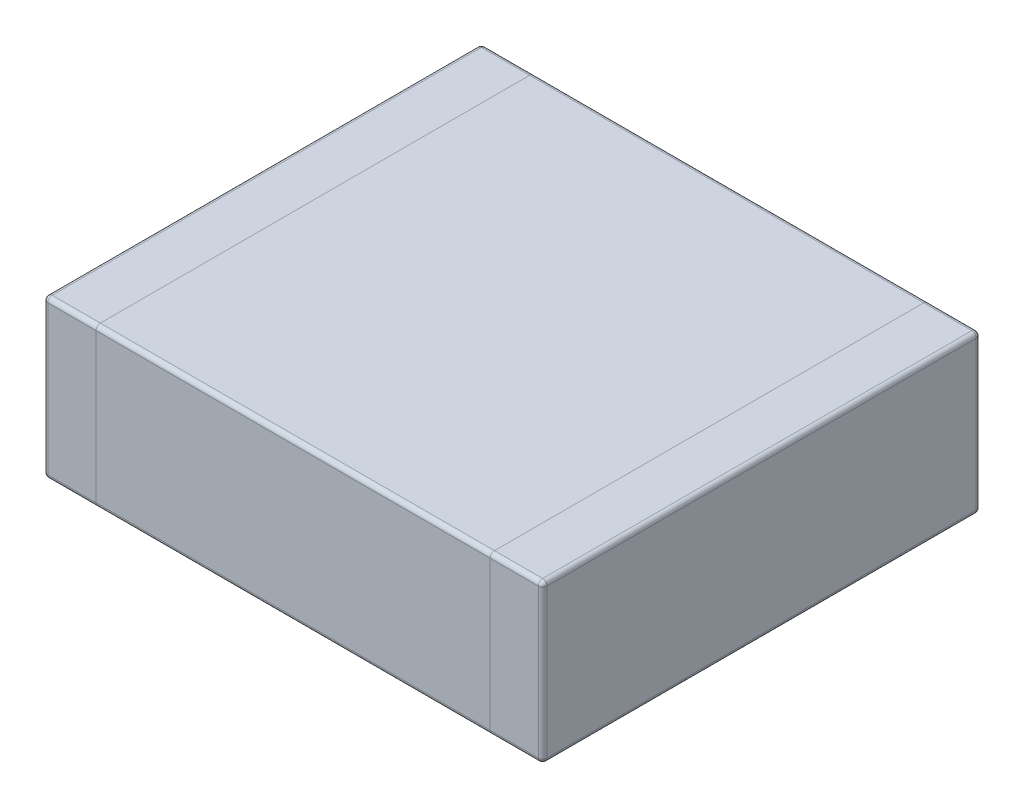
ISO-10303-21;
HEADER;
FILE_DESCRIPTION(('STEP AP214'),'2;1');
FILE_NAME('part.step','',(''),(''),'','','');
FILE_SCHEMA(('AUTOMOTIVE_DESIGN { 1 0 10303 214 1 1 1 1 }'));
ENDSEC;
DATA;
#1=APPLICATION_CONTEXT('core data for automotive mechanical design processes');
#2=APPLICATION_PROTOCOL_DEFINITION('international standard','automotive_design',2000,#1);
#3=PRODUCT_CONTEXT('',#1,'mechanical');
#4=PRODUCT('Part','Part','',(#3));
#5=PRODUCT_RELATED_PRODUCT_CATEGORY('part','',(#4));
#6=PRODUCT_DEFINITION_FORMATION('','',#4);
#7=PRODUCT_DEFINITION_CONTEXT('part definition',#1,'design');
#8=PRODUCT_DEFINITION('design','',#6,#7);
#9=PRODUCT_DEFINITION_SHAPE('','',#8);
#10=(LENGTH_UNIT() NAMED_UNIT(*) SI_UNIT(.MILLI.,.METRE.));
#11=(NAMED_UNIT(*) PLANE_ANGLE_UNIT() SI_UNIT($,.RADIAN.));
#12=(NAMED_UNIT(*) SI_UNIT($,.STERADIAN.) SOLID_ANGLE_UNIT());
#13=UNCERTAINTY_MEASURE_WITH_UNIT(LENGTH_MEASURE(1.E-05),#10,'distance_accuracy_value','');
#14=(GEOMETRIC_REPRESENTATION_CONTEXT(3) GLOBAL_UNCERTAINTY_ASSIGNED_CONTEXT((#13)) GLOBAL_UNIT_ASSIGNED_CONTEXT((#10,
#11,#12)) REPRESENTATION_CONTEXT('',''));
#15=CARTESIAN_POINT('',(0.,0.,0.));
#16=DIRECTION('',(0.,0.,1.));
#17=DIRECTION('',(1.,0.,0.));
#18=AXIS2_PLACEMENT_3D('',#15,#16,#17);
#19=CARTESIAN_POINT('',(2.85,1.8,-2.5));
#20=DIRECTION('',(0.,-1.,0.));
#21=DIRECTION('',(0.,0.,-1.));
#22=AXIS2_PLACEMENT_3D('',#19,#20,#21);
#23=PLANE('',#22);
#24=DIRECTION('',(0.,0.,1.));
#25=VECTOR('',#24,1.);
#26=CARTESIAN_POINT('',(-2.25,1.8,-2.5));
#27=LINE('',#26,#25);
#28=CARTESIAN_POINT('',(-2.25,1.8,-2.45));
#29=VERTEX_POINT('',#28);
#30=CARTESIAN_POINT('',(-2.25,1.8,2.45));
#31=VERTEX_POINT('',#30);
#32=EDGE_CURVE('E11',#29,#31,#27,.T.);
#33=ORIENTED_EDGE('',*,*,#32,.F.);
#34=DIRECTION('',(-1.,0.,0.));
#35=VECTOR('',#34,1.);
#36=CARTESIAN_POINT('',(2.85,1.8,-2.45));
#37=LINE('',#36,#35);
#38=CARTESIAN_POINT('',(-2.8,1.8,-2.45));
#39=VERTEX_POINT('',#38);
#40=EDGE_CURVE('E253',#29,#39,#37,.T.);
#41=ORIENTED_EDGE('',*,*,#40,.T.);
#42=DIRECTION('',(0.,0.,1.));
#43=VECTOR('',#42,1.);
#44=CARTESIAN_POINT('',(-2.8,1.8,-2.5));
#45=LINE('',#44,#43);
#46=CARTESIAN_POINT('',(-2.8,1.8,2.45));
#47=VERTEX_POINT('',#46);
#48=EDGE_CURVE('E256',#39,#47,#45,.T.);
#49=ORIENTED_EDGE('',*,*,#48,.T.);
#50=DIRECTION('',(1.,0.,0.));
#51=VECTOR('',#50,1.);
#52=CARTESIAN_POINT('',(2.85,1.8,2.45));
#53=LINE('',#52,#51);
#54=EDGE_CURVE('E260',#47,#31,#53,.T.);
#55=ORIENTED_EDGE('',*,*,#54,.T.);
#56=EDGE_LOOP('',(#33,#41,#49,#55));
#57=FACE_BOUND('',#56,.T.);
#58=ADVANCED_FACE('F37',(#57),#23,.F.);
#59=DIRECTION('',(0.,0.,-1.));
#60=VECTOR('',#59,1.);
#61=CARTESIAN_POINT('',(2.25,1.8,-2.5));
#62=LINE('',#61,#60);
#63=CARTESIAN_POINT('',(2.25,1.8,2.45));
#64=VERTEX_POINT('',#63);
#65=CARTESIAN_POINT('',(2.25,1.8,-2.45));
#66=VERTEX_POINT('',#65);
#67=EDGE_CURVE('E47',#64,#66,#62,.T.);
#68=ORIENTED_EDGE('',*,*,#67,.F.);
#69=CARTESIAN_POINT('',(2.8,1.8,2.45));
#70=VERTEX_POINT('',#69);
#71=EDGE_CURVE('E259',#64,#70,#53,.T.);
#72=ORIENTED_EDGE('',*,*,#71,.T.);
#73=DIRECTION('',(0.,0.,-1.));
#74=VECTOR('',#73,1.);
#75=CARTESIAN_POINT('',(2.8,1.8,-2.5));
#76=LINE('',#75,#74);
#77=CARTESIAN_POINT('',(2.8,1.8,-2.45));
#78=VERTEX_POINT('',#77);
#79=EDGE_CURVE('E250',#70,#78,#76,.T.);
#80=ORIENTED_EDGE('',*,*,#79,.T.);
#81=EDGE_CURVE('E254',#78,#66,#37,.T.);
#82=ORIENTED_EDGE('',*,*,#81,.T.);
#83=EDGE_LOOP('',(#68,#72,#80,#82));
#84=FACE_BOUND('',#83,.T.);
#85=ADVANCED_FACE('F526',(#84),#23,.F.);
#86=CARTESIAN_POINT('',(2.85,1.75,2.45));
#87=DIRECTION('',(1.,0.,0.));
#88=DIRECTION('',(0.,0.,-1.));
#89=AXIS2_PLACEMENT_3D('',#86,#87,#88);
#90=CYLINDRICAL_SURFACE('',#89,0.05);
#91=DIRECTION('',(1.,0.,0.));
#92=VECTOR('',#91,1.);
#93=CARTESIAN_POINT('',(-2.85,1.75,2.5));
#94=LINE('',#93,#92);
#95=CARTESIAN_POINT('',(-2.25,1.75,2.5));
#96=VERTEX_POINT('',#95);
#97=CARTESIAN_POINT('',(-2.8,1.75,2.5));
#98=VERTEX_POINT('',#97);
#99=EDGE_CURVE('E246',#96,#98,#94,.F.);
#100=ORIENTED_EDGE('',*,*,#99,.F.);
#101=CARTESIAN_POINT('',(-2.25,1.75,2.45));
#102=DIRECTION('',(1.,0.,0.));
#103=DIRECTION('',(0.,0.,-1.));
#104=AXIS2_PLACEMENT_3D('',#101,#102,#103);
#105=CIRCLE('',#104,0.05);
#106=EDGE_CURVE('E354',#96,#31,#105,.F.);
#107=ORIENTED_EDGE('',*,*,#106,.T.);
#108=ORIENTED_EDGE('',*,*,#54,.F.);
#109=CARTESIAN_POINT('',(-2.8,1.75,2.45));
#110=DIRECTION('',(-1.,0.,0.));
#111=DIRECTION('',(0.,-1.,0.));
#112=AXIS2_PLACEMENT_3D('',#109,#110,#111);
#113=CIRCLE('',#112,0.05);
#114=EDGE_CURVE('E330',#47,#98,#113,.F.);
#115=ORIENTED_EDGE('',*,*,#114,.T.);
#116=EDGE_LOOP('',(#100,#107,#108,#115));
#117=FACE_BOUND('',#116,.T.);
#118=ADVANCED_FACE('F483',(#117),#90,.T.);
#119=ORIENTED_EDGE('',*,*,#71,.F.);
#120=CARTESIAN_POINT('',(2.25,1.75,2.45));
#121=DIRECTION('',(-1.,0.,0.));
#122=DIRECTION('',(0.,0.,1.));
#123=AXIS2_PLACEMENT_3D('',#120,#121,#122);
#124=CIRCLE('',#123,0.05);
#125=CARTESIAN_POINT('',(2.25,1.75,2.5));
#126=VERTEX_POINT('',#125);
#127=EDGE_CURVE('E353',#64,#126,#124,.F.);
#128=ORIENTED_EDGE('',*,*,#127,.T.);
#129=CARTESIAN_POINT('',(2.8,1.75,2.5));
#130=VERTEX_POINT('',#129);
#131=EDGE_CURVE('E247',#130,#126,#94,.F.);
#132=ORIENTED_EDGE('',*,*,#131,.F.);
#133=CARTESIAN_POINT('',(2.8,1.75,2.45));
#134=DIRECTION('',(1.,0.,0.));
#135=DIRECTION('',(0.,0.,-1.));
#136=AXIS2_PLACEMENT_3D('',#133,#134,#135);
#137=CIRCLE('',#136,0.05);
#138=EDGE_CURVE('E315',#70,#130,#137,.T.);
#139=ORIENTED_EDGE('',*,*,#138,.F.);
#140=EDGE_LOOP('',(#119,#128,#132,#139));
#141=FACE_BOUND('',#140,.T.);
#142=ADVANCED_FACE('F457',(#141),#90,.T.);
#143=CARTESIAN_POINT('',(-2.85,1.8,2.5));
#144=DIRECTION('',(0.,0.,-1.));
#145=DIRECTION('',(-1.,0.,0.));
#146=AXIS2_PLACEMENT_3D('',#143,#144,#145);
#147=PLANE('',#146);
#148=DIRECTION('',(0.,-1.,0.));
#149=VECTOR('',#148,1.);
#150=CARTESIAN_POINT('',(-2.25,1.8,2.5));
#151=LINE('',#150,#149);
#152=CARTESIAN_POINT('',(-2.25,0.0499999999999999,2.5));
#153=VERTEX_POINT('',#152);
#154=EDGE_CURVE('E349',#96,#153,#151,.T.);
#155=ORIENTED_EDGE('',*,*,#154,.F.);
#156=ORIENTED_EDGE('',*,*,#99,.T.);
#157=DIRECTION('',(0.,-1.,0.));
#158=VECTOR('',#157,1.);
#159=CARTESIAN_POINT('',(-2.8,1.8,2.5));
#160=LINE('',#159,#158);
#161=CARTESIAN_POINT('',(-2.8,0.0499999999999999,2.5));
#162=VERTEX_POINT('',#161);
#163=EDGE_CURVE('E243',#98,#162,#160,.T.);
#164=ORIENTED_EDGE('',*,*,#163,.T.);
#165=DIRECTION('',(1.,0.,0.));
#166=VECTOR('',#165,1.);
#167=CARTESIAN_POINT('',(2.85,0.0499999999999999,2.5));
#168=LINE('',#167,#166);
#169=EDGE_CURVE('E237',#162,#153,#168,.T.);
#170=ORIENTED_EDGE('',*,*,#169,.T.);
#171=EDGE_LOOP('',(#155,#156,#164,#170));
#172=FACE_BOUND('',#171,.T.);
#173=ADVANCED_FACE('F471',(#172),#147,.F.);
#174=DIRECTION('',(0.,1.,0.));
#175=VECTOR('',#174,1.);
#176=CARTESIAN_POINT('',(2.25,1.8,2.5));
#177=LINE('',#176,#175);
#178=CARTESIAN_POINT('',(2.25,0.0499999999999999,2.5));
#179=VERTEX_POINT('',#178);
#180=EDGE_CURVE('E345',#179,#126,#177,.T.);
#181=ORIENTED_EDGE('',*,*,#180,.F.);
#182=CARTESIAN_POINT('',(2.8,0.0499999999999999,2.5));
#183=VERTEX_POINT('',#182);
#184=EDGE_CURVE('E236',#179,#183,#168,.T.);
#185=ORIENTED_EDGE('',*,*,#184,.T.);
#186=DIRECTION('',(0.,-1.,0.));
#187=VECTOR('',#186,1.);
#188=CARTESIAN_POINT('',(2.8,1.8,2.5));
#189=LINE('',#188,#187);
#190=EDGE_CURVE('E240',#183,#130,#189,.F.);
#191=ORIENTED_EDGE('',*,*,#190,.T.);
#192=ORIENTED_EDGE('',*,*,#131,.T.);
#193=EDGE_LOOP('',(#181,#185,#191,#192));
#194=FACE_BOUND('',#193,.T.);
#195=ADVANCED_FACE('F453',(#194),#147,.F.);
#196=CARTESIAN_POINT('',(-2.85,0.0499999999999999,2.45));
#197=DIRECTION('',(-1.,0.,0.));
#198=DIRECTION('',(0.,0.,1.));
#199=AXIS2_PLACEMENT_3D('',#196,#197,#198);
#200=CYLINDRICAL_SURFACE('',#199,0.05);
#201=DIRECTION('',(1.,0.,0.));
#202=VECTOR('',#201,1.);
#203=CARTESIAN_POINT('',(-2.85,0.,2.45));
#204=LINE('',#203,#202);
#205=CARTESIAN_POINT('',(-2.25,0.,2.45));
#206=VERTEX_POINT('',#205);
#207=CARTESIAN_POINT('',(-2.8,0.,2.45));
#208=VERTEX_POINT('',#207);
#209=EDGE_CURVE('E266',#206,#208,#204,.F.);
#210=ORIENTED_EDGE('',*,*,#209,.F.);
#211=CARTESIAN_POINT('',(-2.25,0.0499999999999999,2.45));
#212=DIRECTION('',(1.,0.,0.));
#213=DIRECTION('',(0.,0.,-1.));
#214=AXIS2_PLACEMENT_3D('',#211,#212,#213);
#215=CIRCLE('',#214,0.05);
#216=EDGE_CURVE('E350',#206,#153,#215,.F.);
#217=ORIENTED_EDGE('',*,*,#216,.T.);
#218=ORIENTED_EDGE('',*,*,#169,.F.);
#219=CARTESIAN_POINT('',(-2.8,0.05,2.45));
#220=DIRECTION('',(-1.,0.,0.));
#221=DIRECTION('',(0.,0.,1.));
#222=AXIS2_PLACEMENT_3D('',#219,#220,#221);
#223=CIRCLE('',#222,0.05);
#224=EDGE_CURVE('E321',#162,#208,#223,.F.);
#225=ORIENTED_EDGE('',*,*,#224,.T.);
#226=EDGE_LOOP('',(#210,#217,#218,#225));
#227=FACE_BOUND('',#226,.T.);
#228=ADVANCED_FACE('F509',(#227),#200,.T.);
#229=ORIENTED_EDGE('',*,*,#184,.F.);
#230=CARTESIAN_POINT('',(2.25,0.0499999999999999,2.45));
#231=DIRECTION('',(-1.,0.,0.));
#232=DIRECTION('',(0.,0.,1.));
#233=AXIS2_PLACEMENT_3D('',#230,#231,#232);
#234=CIRCLE('',#233,0.05);
#235=CARTESIAN_POINT('',(2.25,0.,2.45));
#236=VERTEX_POINT('',#235);
#237=EDGE_CURVE('E365',#179,#236,#234,.F.);
#238=ORIENTED_EDGE('',*,*,#237,.T.);
#239=CARTESIAN_POINT('',(2.8,0.,2.45));
#240=VERTEX_POINT('',#239);
#241=EDGE_CURVE('E267',#240,#236,#204,.F.);
#242=ORIENTED_EDGE('',*,*,#241,.F.);
#243=CARTESIAN_POINT('',(2.8,0.0499999999999999,2.45));
#244=DIRECTION('',(1.,0.,0.));
#245=DIRECTION('',(0.,0.,-1.));
#246=AXIS2_PLACEMENT_3D('',#243,#244,#245);
#247=CIRCLE('',#246,0.05);
#248=EDGE_CURVE('E301',#183,#240,#247,.T.);
#249=ORIENTED_EDGE('',*,*,#248,.F.);
#250=EDGE_LOOP('',(#229,#238,#242,#249));
#251=FACE_BOUND('',#250,.T.);
#252=ADVANCED_FACE('F443',(#251),#200,.T.);
#253=CARTESIAN_POINT('',(2.85,0.,-2.5));
#254=DIRECTION('',(0.,-1.,0.));
#255=DIRECTION('',(0.,0.,-1.));
#256=AXIS2_PLACEMENT_3D('',#253,#254,#255);
#257=PLANE('',#256);
#258=DIRECTION('',(-1.,0.,0.));
#259=VECTOR('',#258,1.);
#260=CARTESIAN_POINT('',(2.85,0.,-2.45));
#261=LINE('',#260,#259);
#262=CARTESIAN_POINT('',(-2.8,0.,-2.45));
#263=VERTEX_POINT('',#262);
#264=CARTESIAN_POINT('',(-2.25,0.,-2.45));
#265=VERTEX_POINT('',#264);
#266=EDGE_CURVE('E274',#263,#265,#261,.F.);
#267=ORIENTED_EDGE('',*,*,#266,.T.);
#268=DIRECTION('',(0.,0.,1.));
#269=VECTOR('',#268,1.);
#270=CARTESIAN_POINT('',(-2.25,0.,-2.5));
#271=LINE('',#270,#269);
#272=EDGE_CURVE('E366',#265,#206,#271,.T.);
#273=ORIENTED_EDGE('',*,*,#272,.T.);
#274=ORIENTED_EDGE('',*,*,#209,.T.);
#275=DIRECTION('',(0.,0.,1.));
#276=VECTOR('',#275,1.);
#277=CARTESIAN_POINT('',(-2.8,0.,-2.5));
#278=LINE('',#277,#276);
#279=EDGE_CURVE('E270',#208,#263,#278,.F.);
#280=ORIENTED_EDGE('',*,*,#279,.T.);
#281=EDGE_LOOP('',(#267,#273,#274,#280));
#282=FACE_BOUND('',#281,.T.);
#283=ADVANCED_FACE('F512',(#282),#257,.T.);
#284=ORIENTED_EDGE('',*,*,#241,.T.);
#285=DIRECTION('',(0.,0.,-1.));
#286=VECTOR('',#285,1.);
#287=CARTESIAN_POINT('',(2.25,0.,-2.5));
#288=LINE('',#287,#286);
#289=CARTESIAN_POINT('',(2.25,0.,-2.45));
#290=VERTEX_POINT('',#289);
#291=EDGE_CURVE('E360',#236,#290,#288,.T.);
#292=ORIENTED_EDGE('',*,*,#291,.T.);
#293=CARTESIAN_POINT('',(2.8,0.,-2.45));
#294=VERTEX_POINT('',#293);
#295=EDGE_CURVE('E273',#290,#294,#261,.F.);
#296=ORIENTED_EDGE('',*,*,#295,.T.);
#297=DIRECTION('',(0.,0.,-1.));
#298=VECTOR('',#297,1.);
#299=CARTESIAN_POINT('',(2.8,0.,2.5));
#300=LINE('',#299,#298);
#301=EDGE_CURVE('E263',#294,#240,#300,.F.);
#302=ORIENTED_EDGE('',*,*,#301,.T.);
#303=EDGE_LOOP('',(#284,#292,#296,#302));
#304=FACE_BOUND('',#303,.T.);
#305=ADVANCED_FACE('F387',(#304),#257,.T.);
#306=CARTESIAN_POINT('',(2.85,1.75,-2.45));
#307=DIRECTION('',(-1.,0.,0.));
#308=DIRECTION('',(0.,0.,1.));
#309=AXIS2_PLACEMENT_3D('',#306,#307,#308);
#310=CYLINDRICAL_SURFACE('',#309,0.05);
#311=ORIENTED_EDGE('',*,*,#40,.F.);
#312=CARTESIAN_POINT('',(-2.25,1.75,-2.45));
#313=DIRECTION('',(1.,0.,0.));
#314=DIRECTION('',(0.,0.,-1.));
#315=AXIS2_PLACEMENT_3D('',#312,#313,#314);
#316=CIRCLE('',#315,0.05);
#317=CARTESIAN_POINT('',(-2.25,1.75,-2.5));
#318=VERTEX_POINT('',#317);
#319=EDGE_CURVE('E357',#29,#318,#316,.F.);
#320=ORIENTED_EDGE('',*,*,#319,.T.);
#321=DIRECTION('',(-1.,0.,0.));
#322=VECTOR('',#321,1.);
#323=CARTESIAN_POINT('',(-2.85,1.75,-2.5));
#324=LINE('',#323,#322);
#325=CARTESIAN_POINT('',(-2.8,1.75,-2.5));
#326=VERTEX_POINT('',#325);
#327=EDGE_CURVE('E216',#326,#318,#324,.F.);
#328=ORIENTED_EDGE('',*,*,#327,.F.);
#329=CARTESIAN_POINT('',(-2.8,1.75,-2.45));
#330=DIRECTION('',(-1.,0.,0.));
#331=DIRECTION('',(0.,0.,1.));
#332=AXIS2_PLACEMENT_3D('',#329,#330,#331);
#333=CIRCLE('',#332,0.05);
#334=EDGE_CURVE('E292',#326,#39,#333,.F.);
#335=ORIENTED_EDGE('',*,*,#334,.T.);
#336=EDGE_LOOP('',(#311,#320,#328,#335));
#337=FACE_BOUND('',#336,.T.);
#338=ADVANCED_FACE('F519',(#337),#310,.T.);
#339=CARTESIAN_POINT('',(2.25,1.75,-2.5));
#340=VERTEX_POINT('',#339);
#341=CARTESIAN_POINT('',(2.8,1.75,-2.5));
#342=VERTEX_POINT('',#341);
#343=EDGE_CURVE('E211',#340,#342,#324,.F.);
#344=ORIENTED_EDGE('',*,*,#343,.F.);
#345=CARTESIAN_POINT('',(2.25,1.75,-2.45));
#346=DIRECTION('',(-1.,0.,0.));
#347=DIRECTION('',(0.,0.,1.));
#348=AXIS2_PLACEMENT_3D('',#345,#346,#347);
#349=CIRCLE('',#348,0.05);
#350=EDGE_CURVE('E361',#340,#66,#349,.F.);
#351=ORIENTED_EDGE('',*,*,#350,.T.);
#352=ORIENTED_EDGE('',*,*,#81,.F.);
#353=CARTESIAN_POINT('',(2.8,1.75,-2.45));
#354=DIRECTION('',(1.,0.,0.));
#355=DIRECTION('',(0.,1.,0.));
#356=AXIS2_PLACEMENT_3D('',#353,#354,#355);
#357=CIRCLE('',#356,0.05);
#358=EDGE_CURVE('E196',#342,#78,#357,.T.);
#359=ORIENTED_EDGE('',*,*,#358,.F.);
#360=EDGE_LOOP('',(#344,#351,#352,#359));
#361=FACE_BOUND('',#360,.T.);
#362=ADVANCED_FACE('F422',(#361),#310,.T.);
#363=CARTESIAN_POINT('',(-2.85,0.0499999999999999,-2.45));
#364=DIRECTION('',(1.,0.,0.));
#365=DIRECTION('',(0.,0.,-1.));
#366=AXIS2_PLACEMENT_3D('',#363,#364,#365);
#367=CYLINDRICAL_SURFACE('',#366,0.05);
#368=DIRECTION('',(-1.,0.,0.));
#369=VECTOR('',#368,1.);
#370=CARTESIAN_POINT('',(-2.85,0.0499999999999999,-2.5));
#371=LINE('',#370,#369);
#372=CARTESIAN_POINT('',(-2.25,0.0499999999999999,-2.5));
#373=VERTEX_POINT('',#372);
#374=CARTESIAN_POINT('',(-2.8,0.0499999999999999,-2.5));
#375=VERTEX_POINT('',#374);
#376=EDGE_CURVE('E208',#373,#375,#371,.T.);
#377=ORIENTED_EDGE('',*,*,#376,.F.);
#378=CARTESIAN_POINT('',(-2.25,0.0499999999999999,-2.45));
#379=DIRECTION('',(1.,0.,0.));
#380=DIRECTION('',(0.,0.,-1.));
#381=AXIS2_PLACEMENT_3D('',#378,#379,#380);
#382=CIRCLE('',#381,0.05);
#383=EDGE_CURVE('E370',#373,#265,#382,.F.);
#384=ORIENTED_EDGE('',*,*,#383,.T.);
#385=ORIENTED_EDGE('',*,*,#266,.F.);
#386=CARTESIAN_POINT('',(-2.8,0.0499999999999999,-2.45));
#387=DIRECTION('',(-1.,0.,0.));
#388=DIRECTION('',(0.,0.,1.));
#389=AXIS2_PLACEMENT_3D('',#386,#387,#388);
#390=CIRCLE('',#389,0.05);
#391=EDGE_CURVE('E289',#263,#375,#390,.F.);
#392=ORIENTED_EDGE('',*,*,#391,.T.);
#393=EDGE_LOOP('',(#377,#384,#385,#392));
#394=FACE_BOUND('',#393,.T.);
#395=ADVANCED_FACE('F405',(#394),#367,.T.);
#396=ORIENTED_EDGE('',*,*,#295,.F.);
#397=CARTESIAN_POINT('',(2.25,0.0499999999999999,-2.45));
#398=DIRECTION('',(-1.,0.,0.));
#399=DIRECTION('',(0.,0.,1.));
#400=AXIS2_PLACEMENT_3D('',#397,#398,#399);
#401=CIRCLE('',#400,0.05);
#402=CARTESIAN_POINT('',(2.25,0.0499999999999999,-2.5));
#403=VERTEX_POINT('',#402);
#404=EDGE_CURVE('E41',#290,#403,#401,.F.);
#405=ORIENTED_EDGE('',*,*,#404,.T.);
#406=CARTESIAN_POINT('',(2.8,0.0499999999999999,-2.5));
#407=VERTEX_POINT('',#406);
#408=EDGE_CURVE('E199',#407,#403,#371,.T.);
#409=ORIENTED_EDGE('',*,*,#408,.F.);
#410=CARTESIAN_POINT('',(2.8,0.05,-2.45));
#411=DIRECTION('',(1.,0.,0.));
#412=DIRECTION('',(0.,0.,-1.));
#413=AXIS2_PLACEMENT_3D('',#410,#411,#412);
#414=CIRCLE('',#413,0.05);
#415=EDGE_CURVE('E188',#294,#407,#414,.T.);
#416=ORIENTED_EDGE('',*,*,#415,.F.);
#417=EDGE_LOOP('',(#396,#405,#409,#416));
#418=FACE_BOUND('',#417,.T.);
#419=ADVANCED_FACE('F200',(#418),#367,.T.);
#420=CARTESIAN_POINT('',(-2.85,1.8,-2.5));
#421=DIRECTION('',(0.,0.,1.));
#422=DIRECTION('',(1.,0.,0.));
#423=AXIS2_PLACEMENT_3D('',#420,#421,#422);
#424=PLANE('',#423);
#425=DIRECTION('',(0.,1.,0.));
#426=VECTOR('',#425,1.);
#427=CARTESIAN_POINT('',(-2.25,1.8,-2.5));
#428=LINE('',#427,#426);
#429=EDGE_CURVE('E341',#373,#318,#428,.T.);
#430=ORIENTED_EDGE('',*,*,#429,.F.);
#431=ORIENTED_EDGE('',*,*,#376,.T.);
#432=DIRECTION('',(0.,-1.,0.));
#433=VECTOR('',#432,1.);
#434=CARTESIAN_POINT('',(-2.8,1.8,-2.5));
#435=LINE('',#434,#433);
#436=EDGE_CURVE('E205',#375,#326,#435,.F.);
#437=ORIENTED_EDGE('',*,*,#436,.T.);
#438=ORIENTED_EDGE('',*,*,#327,.T.);
#439=EDGE_LOOP('',(#430,#431,#437,#438));
#440=FACE_BOUND('',#439,.T.);
#441=ADVANCED_FACE('F408',(#440),#424,.F.);
#442=DIRECTION('',(0.,-1.,0.));
#443=VECTOR('',#442,1.);
#444=CARTESIAN_POINT('',(2.25,1.8,-2.5));
#445=LINE('',#444,#443);
#446=EDGE_CURVE('E276',#340,#403,#445,.T.);
#447=ORIENTED_EDGE('',*,*,#446,.F.);
#448=ORIENTED_EDGE('',*,*,#343,.T.);
#449=DIRECTION('',(0.,-1.,0.));
#450=VECTOR('',#449,1.);
#451=CARTESIAN_POINT('',(2.8,1.8,-2.5));
#452=LINE('',#451,#450);
#453=EDGE_CURVE('E180',#342,#407,#452,.T.);
#454=ORIENTED_EDGE('',*,*,#453,.T.);
#455=ORIENTED_EDGE('',*,*,#408,.T.);
#456=EDGE_LOOP('',(#447,#448,#454,#455));
#457=FACE_BOUND('',#456,.T.);
#458=ADVANCED_FACE('F209',(#457),#424,.F.);
#459=CARTESIAN_POINT('',(2.85,1.8,2.5));
#460=DIRECTION('',(-1.,0.,0.));
#461=DIRECTION('',(0.,0.,1.));
#462=AXIS2_PLACEMENT_3D('',#459,#460,#461);
#463=PLANE('',#462);
#464=DIRECTION('',(0.,-1.,0.));
#465=VECTOR('',#464,1.);
#466=CARTESIAN_POINT('',(2.85,1.8,-2.45));
#467=LINE('',#466,#465);
#468=CARTESIAN_POINT('',(2.85,0.0499999999999999,-2.45));
#469=VERTEX_POINT('',#468);
#470=CARTESIAN_POINT('',(2.85,1.75,-2.45));
#471=VERTEX_POINT('',#470);
#472=EDGE_CURVE('E182',#469,#471,#467,.F.);
#473=ORIENTED_EDGE('',*,*,#472,.T.);
#474=DIRECTION('',(0.,0.,-1.));
#475=VECTOR('',#474,1.);
#476=CARTESIAN_POINT('',(2.85,1.75,2.5));
#477=LINE('',#476,#475);
#478=CARTESIAN_POINT('',(2.85,1.75,2.45));
#479=VERTEX_POINT('',#478);
#480=EDGE_CURVE('E225',#471,#479,#477,.F.);
#481=ORIENTED_EDGE('',*,*,#480,.T.);
#482=DIRECTION('',(0.,-1.,0.));
#483=VECTOR('',#482,1.);
#484=CARTESIAN_POINT('',(2.85,1.8,2.45));
#485=LINE('',#484,#483);
#486=CARTESIAN_POINT('',(2.85,0.0499999999999999,2.45));
#487=VERTEX_POINT('',#486);
#488=EDGE_CURVE('E222',#479,#487,#485,.T.);
#489=ORIENTED_EDGE('',*,*,#488,.T.);
#490=DIRECTION('',(0.,0.,-1.));
#491=VECTOR('',#490,1.);
#492=CARTESIAN_POINT('',(2.85,0.0499999999999999,-2.5));
#493=LINE('',#492,#491);
#494=EDGE_CURVE('E220',#487,#469,#493,.T.);
#495=ORIENTED_EDGE('',*,*,#494,.T.);
#496=EDGE_LOOP('',(#473,#481,#489,#495));
#497=FACE_BOUND('',#496,.T.);
#498=ADVANCED_FACE('F434',(#497),#463,.F.);
#499=EDGE_CURVE('E206',#403,#373,#371,.T.);
#500=ORIENTED_EDGE('',*,*,#499,.T.);
#501=ORIENTED_EDGE('',*,*,#429,.T.);
#502=EDGE_CURVE('E214',#318,#340,#324,.F.);
#503=ORIENTED_EDGE('',*,*,#502,.T.);
#504=ORIENTED_EDGE('',*,*,#446,.T.);
#505=EDGE_LOOP('',(#500,#501,#503,#504));
#506=FACE_BOUND('',#505,.T.);
#507=ADVANCED_FACE('F414',(#506),#424,.F.);
#508=CARTESIAN_POINT('',(-2.85,1.8,2.5));
#509=DIRECTION('',(1.,0.,0.));
#510=DIRECTION('',(0.,0.,-1.));
#511=AXIS2_PLACEMENT_3D('',#508,#509,#510);
#512=PLANE('',#511);
#513=DIRECTION('',(0.,-1.,0.));
#514=VECTOR('',#513,1.);
#515=CARTESIAN_POINT('',(-2.85,1.8,2.45));
#516=LINE('',#515,#514);
#517=CARTESIAN_POINT('',(-2.85,0.0499999999999999,2.45));
#518=VERTEX_POINT('',#517);
#519=CARTESIAN_POINT('',(-2.85,1.75,2.45));
#520=VERTEX_POINT('',#519);
#521=EDGE_CURVE('E229',#518,#520,#516,.F.);
#522=ORIENTED_EDGE('',*,*,#521,.T.);
#523=DIRECTION('',(0.,0.,1.));
#524=VECTOR('',#523,1.);
#525=CARTESIAN_POINT('',(-2.85,1.75,2.5));
#526=LINE('',#525,#524);
#527=CARTESIAN_POINT('',(-2.85,1.75,-2.45));
#528=VERTEX_POINT('',#527);
#529=EDGE_CURVE('E234',#520,#528,#526,.F.);
#530=ORIENTED_EDGE('',*,*,#529,.T.);
#531=DIRECTION('',(0.,-1.,0.));
#532=VECTOR('',#531,1.);
#533=CARTESIAN_POINT('',(-2.85,1.8,-2.45));
#534=LINE('',#533,#532);
#535=CARTESIAN_POINT('',(-2.85,0.0499999999999999,-2.45));
#536=VERTEX_POINT('',#535);
#537=EDGE_CURVE('E231',#528,#536,#534,.T.);
#538=ORIENTED_EDGE('',*,*,#537,.T.);
#539=DIRECTION('',(0.,0.,1.));
#540=VECTOR('',#539,1.);
#541=CARTESIAN_POINT('',(-2.85,0.0499999999999999,2.5));
#542=LINE('',#541,#540);
#543=EDGE_CURVE('E227',#536,#518,#542,.T.);
#544=ORIENTED_EDGE('',*,*,#543,.T.);
#545=EDGE_LOOP('',(#522,#530,#538,#544));
#546=FACE_BOUND('',#545,.T.);
#547=ADVANCED_FACE('F491',(#546),#512,.F.);
#548=EDGE_CURVE('E251',#126,#96,#94,.F.);
#549=ORIENTED_EDGE('',*,*,#548,.T.);
#550=ORIENTED_EDGE('',*,*,#154,.T.);
#551=EDGE_CURVE('E241',#153,#179,#168,.T.);
#552=ORIENTED_EDGE('',*,*,#551,.T.);
#553=ORIENTED_EDGE('',*,*,#180,.T.);
#554=EDGE_LOOP('',(#549,#550,#552,#553));
#555=FACE_BOUND('',#554,.T.);
#556=ADVANCED_FACE('F464',(#555),#147,.F.);
#557=EDGE_CURVE('E257',#66,#29,#37,.T.);
#558=ORIENTED_EDGE('',*,*,#557,.T.);
#559=ORIENTED_EDGE('',*,*,#32,.T.);
#560=EDGE_CURVE('E264',#31,#64,#53,.T.);
#561=ORIENTED_EDGE('',*,*,#560,.T.);
#562=ORIENTED_EDGE('',*,*,#67,.T.);
#563=EDGE_LOOP('',(#558,#559,#561,#562));
#564=FACE_BOUND('',#563,.T.);
#565=ADVANCED_FACE('F524',(#564),#23,.F.);
#566=ORIENTED_EDGE('',*,*,#272,.F.);
#567=EDGE_CURVE('E277',#265,#290,#261,.F.);
#568=ORIENTED_EDGE('',*,*,#567,.T.);
#569=ORIENTED_EDGE('',*,*,#291,.F.);
#570=EDGE_CURVE('E271',#236,#206,#204,.F.);
#571=ORIENTED_EDGE('',*,*,#570,.T.);
#572=EDGE_LOOP('',(#566,#568,#569,#571));
#573=FACE_BOUND('',#572,.T.);
#574=ADVANCED_FACE('F399',(#573),#257,.T.);
#575=CARTESIAN_POINT('',(-2.8,1.8,2.45));
#576=DIRECTION('',(0.,-1.,0.));
#577=DIRECTION('',(0.,0.,-1.));
#578=AXIS2_PLACEMENT_3D('',#575,#576,#577);
#579=CYLINDRICAL_SURFACE('',#578,0.05);
#580=CARTESIAN_POINT('',(-2.8,1.75,2.45));
#581=DIRECTION('',(0.,1.,0.));
#582=DIRECTION('',(0.,0.,1.));
#583=AXIS2_PLACEMENT_3D('',#580,#581,#582);
#584=CIRCLE('',#583,0.05);
#585=EDGE_CURVE('E336',#520,#98,#584,.T.);
#586=ORIENTED_EDGE('',*,*,#585,.F.);
#587=ORIENTED_EDGE('',*,*,#521,.F.);
#588=CARTESIAN_POINT('',(-2.8,0.0499999999999999,2.45));
#589=DIRECTION('',(0.,-1.,0.));
#590=DIRECTION('',(0.,0.,-1.));
#591=AXIS2_PLACEMENT_3D('',#588,#589,#590);
#592=CIRCLE('',#591,0.05);
#593=EDGE_CURVE('E333',#162,#518,#592,.T.);
#594=ORIENTED_EDGE('',*,*,#593,.F.);
#595=ORIENTED_EDGE('',*,*,#163,.F.);
#596=EDGE_LOOP('',(#586,#587,#594,#595));
#597=FACE_BOUND('',#596,.T.);
#598=ADVANCED_FACE('F39',(#597),#579,.T.);
#599=CARTESIAN_POINT('',(-2.8,1.75,2.45));
#600=DIRECTION('',(0.,0.,1.));
#601=DIRECTION('',(1.,0.,0.));
#602=AXIS2_PLACEMENT_3D('',#599,#600,#601);
#603=SPHERICAL_SURFACE('',#602,0.05);
#604=CARTESIAN_POINT('',(-2.8,1.75,2.45));
#605=DIRECTION('',(0.,0.,1.));
#606=DIRECTION('',(1.,0.,0.));
#607=AXIS2_PLACEMENT_3D('',#604,#605,#606);
#608=CIRCLE('',#607,0.05);
#609=EDGE_CURVE('E327',#520,#47,#608,.F.);
#610=ORIENTED_EDGE('',*,*,#609,.F.);
#611=ORIENTED_EDGE('',*,*,#585,.T.);
#612=ORIENTED_EDGE('',*,*,#114,.F.);
#613=EDGE_LOOP('',(#610,#611,#612));
#614=FACE_BOUND('',#613,.T.);
#615=ADVANCED_FACE('F480',(#614),#603,.T.);
#616=CARTESIAN_POINT('',(-2.8,0.05,2.45));
#617=DIRECTION('',(0.,0.,1.));
#618=DIRECTION('',(1.,0.,0.));
#619=AXIS2_PLACEMENT_3D('',#616,#617,#618);
#620=SPHERICAL_SURFACE('',#619,0.05);
#621=ORIENTED_EDGE('',*,*,#224,.F.);
#622=ORIENTED_EDGE('',*,*,#593,.T.);
#623=CARTESIAN_POINT('',(-2.8,0.0499999999999999,2.45));
#624=DIRECTION('',(0.,0.,1.));
#625=DIRECTION('',(1.,0.,0.));
#626=AXIS2_PLACEMENT_3D('',#623,#624,#625);
#627=CIRCLE('',#626,0.05);
#628=EDGE_CURVE('E324',#208,#518,#627,.F.);
#629=ORIENTED_EDGE('',*,*,#628,.F.);
#630=EDGE_LOOP('',(#621,#622,#629));
#631=FACE_BOUND('',#630,.T.);
#632=ADVANCED_FACE('F507',(#631),#620,.T.);
#633=ORIENTED_EDGE('',*,*,#106,.F.);
#634=ORIENTED_EDGE('',*,*,#548,.F.);
#635=ORIENTED_EDGE('',*,*,#127,.F.);
#636=ORIENTED_EDGE('',*,*,#560,.F.);
#637=EDGE_LOOP('',(#633,#634,#635,#636));
#638=FACE_BOUND('',#637,.T.);
#639=ADVANCED_FACE('F466',(#638),#90,.T.);
#640=CARTESIAN_POINT('',(-2.8,1.75,-2.5));
#641=DIRECTION('',(0.,0.,1.));
#642=DIRECTION('',(1.,0.,0.));
#643=AXIS2_PLACEMENT_3D('',#640,#641,#642);
#644=CYLINDRICAL_SURFACE('',#643,0.05);
#645=ORIENTED_EDGE('',*,*,#609,.T.);
#646=ORIENTED_EDGE('',*,*,#48,.F.);
#647=CARTESIAN_POINT('',(-2.8,1.75,-2.45));
#648=DIRECTION('',(0.,0.,-1.));
#649=DIRECTION('',(0.,1.,0.));
#650=AXIS2_PLACEMENT_3D('',#647,#648,#649);
#651=CIRCLE('',#650,0.05);
#652=EDGE_CURVE('E312',#528,#39,#651,.T.);
#653=ORIENTED_EDGE('',*,*,#652,.F.);
#654=ORIENTED_EDGE('',*,*,#529,.F.);
#655=EDGE_LOOP('',(#645,#646,#653,#654));
#656=FACE_BOUND('',#655,.T.);
#657=ADVANCED_FACE('F488',(#656),#644,.T.);
#658=CARTESIAN_POINT('',(-2.8,1.8,-2.45));
#659=DIRECTION('',(0.,-1.,0.));
#660=DIRECTION('',(0.,0.,-1.));
#661=AXIS2_PLACEMENT_3D('',#658,#659,#660);
#662=CYLINDRICAL_SURFACE('',#661,0.05);
#663=CARTESIAN_POINT('',(-2.8,0.0499999999999999,-2.45));
#664=DIRECTION('',(0.,-1.,0.));
#665=DIRECTION('',(0.,0.,-1.));
#666=AXIS2_PLACEMENT_3D('',#663,#664,#665);
#667=CIRCLE('',#666,0.05);
#668=EDGE_CURVE('E306',#536,#375,#667,.T.);
#669=ORIENTED_EDGE('',*,*,#668,.F.);
#670=ORIENTED_EDGE('',*,*,#537,.F.);
#671=CARTESIAN_POINT('',(-2.8,1.75,-2.45));
#672=DIRECTION('',(0.,1.,0.));
#673=DIRECTION('',(0.,0.,1.));
#674=AXIS2_PLACEMENT_3D('',#671,#672,#673);
#675=CIRCLE('',#674,0.05);
#676=EDGE_CURVE('E309',#326,#528,#675,.T.);
#677=ORIENTED_EDGE('',*,*,#676,.F.);
#678=ORIENTED_EDGE('',*,*,#436,.F.);
#679=EDGE_LOOP('',(#669,#670,#677,#678));
#680=FACE_BOUND('',#679,.T.);
#681=ADVANCED_FACE('F495',(#680),#662,.T.);
#682=CARTESIAN_POINT('',(-2.8,0.0499999999999999,2.5));
#683=DIRECTION('',(0.,0.,-1.));
#684=DIRECTION('',(-1.,0.,0.));
#685=AXIS2_PLACEMENT_3D('',#682,#683,#684);
#686=CYLINDRICAL_SURFACE('',#685,0.05);
#687=ORIENTED_EDGE('',*,*,#628,.T.);
#688=ORIENTED_EDGE('',*,*,#543,.F.);
#689=CARTESIAN_POINT('',(-2.8,0.05,-2.45));
#690=DIRECTION('',(0.,0.,-1.));
#691=DIRECTION('',(-1.,0.,0.));
#692=AXIS2_PLACEMENT_3D('',#689,#690,#691);
#693=CIRCLE('',#692,0.05);
#694=EDGE_CURVE('E304',#263,#536,#693,.T.);
#695=ORIENTED_EDGE('',*,*,#694,.F.);
#696=ORIENTED_EDGE('',*,*,#279,.F.);
#697=EDGE_LOOP('',(#687,#688,#695,#696));
#698=FACE_BOUND('',#697,.T.);
#699=ADVANCED_FACE('F502',(#698),#686,.T.);
#700=ORIENTED_EDGE('',*,*,#216,.F.);
#701=ORIENTED_EDGE('',*,*,#570,.F.);
#702=ORIENTED_EDGE('',*,*,#237,.F.);
#703=ORIENTED_EDGE('',*,*,#551,.F.);
#704=EDGE_LOOP('',(#700,#701,#702,#703));
#705=FACE_BOUND('',#704,.T.);
#706=ADVANCED_FACE('F511',(#705),#200,.T.);
#707=CARTESIAN_POINT('',(2.8,1.8,2.45));
#708=DIRECTION('',(0.,-1.,0.));
#709=DIRECTION('',(0.,0.,-1.));
#710=AXIS2_PLACEMENT_3D('',#707,#708,#709);
#711=CYLINDRICAL_SURFACE('',#710,0.05);
#712=CARTESIAN_POINT('',(2.8,1.75,2.45));
#713=DIRECTION('',(0.,1.,0.));
#714=DIRECTION('',(0.,0.,1.));
#715=AXIS2_PLACEMENT_3D('',#712,#713,#714);
#716=CIRCLE('',#715,0.05);
#717=EDGE_CURVE('E318',#130,#479,#716,.T.);
#718=ORIENTED_EDGE('',*,*,#717,.F.);
#719=ORIENTED_EDGE('',*,*,#190,.F.);
#720=CARTESIAN_POINT('',(2.8,0.0499999999999999,2.45));
#721=DIRECTION('',(0.,-1.,0.));
#722=DIRECTION('',(0.,0.,-1.));
#723=AXIS2_PLACEMENT_3D('',#720,#721,#722);
#724=CIRCLE('',#723,0.05);
#725=EDGE_CURVE('E298',#487,#183,#724,.T.);
#726=ORIENTED_EDGE('',*,*,#725,.F.);
#727=ORIENTED_EDGE('',*,*,#488,.F.);
#728=EDGE_LOOP('',(#718,#719,#726,#727));
#729=FACE_BOUND('',#728,.T.);
#730=ADVANCED_FACE('F450',(#729),#711,.T.);
#731=CARTESIAN_POINT('',(2.8,1.75,2.45));
#732=DIRECTION('',(0.,0.,1.));
#733=DIRECTION('',(1.,0.,0.));
#734=AXIS2_PLACEMENT_3D('',#731,#732,#733);
#735=SPHERICAL_SURFACE('',#734,0.05);
#736=ORIENTED_EDGE('',*,*,#138,.T.);
#737=ORIENTED_EDGE('',*,*,#717,.T.);
#738=CARTESIAN_POINT('',(2.8,1.75,2.45));
#739=DIRECTION('',(0.,0.,1.));
#740=DIRECTION('',(0.,-1.,0.));
#741=AXIS2_PLACEMENT_3D('',#738,#739,#740);
#742=CIRCLE('',#741,0.05);
#743=EDGE_CURVE('E295',#70,#479,#742,.F.);
#744=ORIENTED_EDGE('',*,*,#743,.F.);
#745=EDGE_LOOP('',(#736,#737,#744));
#746=FACE_BOUND('',#745,.T.);
#747=ADVANCED_FACE('F535',(#746),#735,.T.);
#748=CARTESIAN_POINT('',(-2.8,1.75,-2.45));
#749=DIRECTION('',(0.,0.,1.));
#750=DIRECTION('',(1.,0.,0.));
#751=AXIS2_PLACEMENT_3D('',#748,#749,#750);
#752=SPHERICAL_SURFACE('',#751,0.05);
#753=ORIENTED_EDGE('',*,*,#676,.T.);
#754=ORIENTED_EDGE('',*,*,#652,.T.);
#755=ORIENTED_EDGE('',*,*,#334,.F.);
#756=EDGE_LOOP('',(#753,#754,#755));
#757=FACE_BOUND('',#756,.T.);
#758=ADVANCED_FACE('F537',(#757),#752,.T.);
#759=CARTESIAN_POINT('',(-2.8,0.05,-2.45));
#760=DIRECTION('',(0.,0.,1.));
#761=DIRECTION('',(1.,0.,0.));
#762=AXIS2_PLACEMENT_3D('',#759,#760,#761);
#763=SPHERICAL_SURFACE('',#762,0.05);
#764=ORIENTED_EDGE('',*,*,#694,.T.);
#765=ORIENTED_EDGE('',*,*,#668,.T.);
#766=ORIENTED_EDGE('',*,*,#391,.F.);
#767=EDGE_LOOP('',(#764,#765,#766));
#768=FACE_BOUND('',#767,.T.);
#769=ADVANCED_FACE('F543',(#768),#763,.T.);
#770=CARTESIAN_POINT('',(2.8,0.05,2.45));
#771=DIRECTION('',(0.,0.,1.));
#772=DIRECTION('',(1.,0.,0.));
#773=AXIS2_PLACEMENT_3D('',#770,#771,#772);
#774=SPHERICAL_SURFACE('',#773,0.05);
#775=ORIENTED_EDGE('',*,*,#725,.T.);
#776=ORIENTED_EDGE('',*,*,#248,.T.);
#777=CARTESIAN_POINT('',(2.8,0.05,2.45));
#778=DIRECTION('',(0.,0.,1.));
#779=DIRECTION('',(1.,0.,0.));
#780=AXIS2_PLACEMENT_3D('',#777,#778,#779);
#781=CIRCLE('',#780,0.05);
#782=EDGE_CURVE('E286',#487,#240,#781,.F.);
#783=ORIENTED_EDGE('',*,*,#782,.F.);
#784=EDGE_LOOP('',(#775,#776,#783));
#785=FACE_BOUND('',#784,.T.);
#786=ADVANCED_FACE('F446',(#785),#774,.T.);
#787=CARTESIAN_POINT('',(2.8,1.75,-2.5));
#788=DIRECTION('',(0.,0.,-1.));
#789=DIRECTION('',(-1.,0.,0.));
#790=AXIS2_PLACEMENT_3D('',#787,#788,#789);
#791=CYLINDRICAL_SURFACE('',#790,0.05);
#792=ORIENTED_EDGE('',*,*,#743,.T.);
#793=ORIENTED_EDGE('',*,*,#480,.F.);
#794=CARTESIAN_POINT('',(2.8,1.75,-2.45));
#795=DIRECTION('',(0.,0.,-1.));
#796=DIRECTION('',(-1.,0.,0.));
#797=AXIS2_PLACEMENT_3D('',#794,#795,#796);
#798=CIRCLE('',#797,0.05);
#799=EDGE_CURVE('E283',#78,#471,#798,.T.);
#800=ORIENTED_EDGE('',*,*,#799,.F.);
#801=ORIENTED_EDGE('',*,*,#79,.F.);
#802=EDGE_LOOP('',(#792,#793,#800,#801));
#803=FACE_BOUND('',#802,.T.);
#804=ADVANCED_FACE('F430',(#803),#791,.T.);
#805=ORIENTED_EDGE('',*,*,#319,.F.);
#806=ORIENTED_EDGE('',*,*,#557,.F.);
#807=ORIENTED_EDGE('',*,*,#350,.F.);
#808=ORIENTED_EDGE('',*,*,#502,.F.);
#809=EDGE_LOOP('',(#805,#806,#807,#808));
#810=FACE_BOUND('',#809,.T.);
#811=ADVANCED_FACE('F417',(#810),#310,.T.);
#812=ORIENTED_EDGE('',*,*,#383,.F.);
#813=ORIENTED_EDGE('',*,*,#499,.F.);
#814=ORIENTED_EDGE('',*,*,#404,.F.);
#815=ORIENTED_EDGE('',*,*,#567,.F.);
#816=EDGE_LOOP('',(#812,#813,#814,#815));
#817=FACE_BOUND('',#816,.T.);
#818=ADVANCED_FACE('F396',(#817),#367,.T.);
#819=CARTESIAN_POINT('',(2.8,0.0499999999999999,2.5));
#820=DIRECTION('',(0.,0.,1.));
#821=DIRECTION('',(1.,0.,0.));
#822=AXIS2_PLACEMENT_3D('',#819,#820,#821);
#823=CYLINDRICAL_SURFACE('',#822,0.05);
#824=ORIENTED_EDGE('',*,*,#782,.T.);
#825=ORIENTED_EDGE('',*,*,#301,.F.);
#826=CARTESIAN_POINT('',(2.8,0.0499999999999999,-2.45));
#827=DIRECTION('',(0.,0.,-1.));
#828=DIRECTION('',(-1.,0.,0.));
#829=AXIS2_PLACEMENT_3D('',#826,#827,#828);
#830=CIRCLE('',#829,0.05);
#831=EDGE_CURVE('E192',#469,#294,#830,.T.);
#832=ORIENTED_EDGE('',*,*,#831,.F.);
#833=ORIENTED_EDGE('',*,*,#494,.F.);
#834=EDGE_LOOP('',(#824,#825,#832,#833));
#835=FACE_BOUND('',#834,.T.);
#836=ADVANCED_FACE('F438',(#835),#823,.T.);
#837=CARTESIAN_POINT('',(2.8,1.75,-2.45));
#838=DIRECTION('',(0.,0.,1.));
#839=DIRECTION('',(1.,0.,0.));
#840=AXIS2_PLACEMENT_3D('',#837,#838,#839);
#841=SPHERICAL_SURFACE('',#840,0.05);
#842=ORIENTED_EDGE('',*,*,#358,.T.);
#843=ORIENTED_EDGE('',*,*,#799,.T.);
#844=CARTESIAN_POINT('',(2.8,1.75,-2.45));
#845=DIRECTION('',(0.,1.,0.));
#846=DIRECTION('',(0.,0.,1.));
#847=AXIS2_PLACEMENT_3D('',#844,#845,#846);
#848=CIRCLE('',#847,0.05);
#849=EDGE_CURVE('E185',#342,#471,#848,.F.);
#850=ORIENTED_EDGE('',*,*,#849,.F.);
#851=EDGE_LOOP('',(#842,#843,#850));
#852=FACE_BOUND('',#851,.T.);
#853=ADVANCED_FACE('F426',(#852),#841,.T.);
#854=CARTESIAN_POINT('',(2.8,0.05,-2.45));
#855=DIRECTION('',(0.,0.,1.));
#856=DIRECTION('',(1.,0.,0.));
#857=AXIS2_PLACEMENT_3D('',#854,#855,#856);
#858=SPHERICAL_SURFACE('',#857,0.05);
#859=ORIENTED_EDGE('',*,*,#831,.T.);
#860=ORIENTED_EDGE('',*,*,#415,.T.);
#861=CARTESIAN_POINT('',(2.8,0.0499999999999999,-2.45));
#862=DIRECTION('',(0.,-1.,0.));
#863=DIRECTION('',(0.,0.,-1.));
#864=AXIS2_PLACEMENT_3D('',#861,#862,#863);
#865=CIRCLE('',#864,0.05);
#866=EDGE_CURVE('E176',#469,#407,#865,.F.);
#867=ORIENTED_EDGE('',*,*,#866,.F.);
#868=EDGE_LOOP('',(#859,#860,#867));
#869=FACE_BOUND('',#868,.T.);
#870=ADVANCED_FACE('F190',(#869),#858,.T.);
#871=CARTESIAN_POINT('',(2.8,1.8,-2.45));
#872=DIRECTION('',(0.,-1.,0.));
#873=DIRECTION('',(0.,0.,-1.));
#874=AXIS2_PLACEMENT_3D('',#871,#872,#873);
#875=CYLINDRICAL_SURFACE('',#874,0.05);
#876=ORIENTED_EDGE('',*,*,#849,.T.);
#877=ORIENTED_EDGE('',*,*,#472,.F.);
#878=ORIENTED_EDGE('',*,*,#866,.T.);
#879=ORIENTED_EDGE('',*,*,#453,.F.);
#880=EDGE_LOOP('',(#876,#877,#878,#879));
#881=FACE_BOUND('',#880,.T.);
#882=ADVANCED_FACE('F178',(#881),#875,.T.);
#883=CLOSED_SHELL('',(#58,#85,#118,#142,#173,#195,#228,#252,#283,#305,#338,#362,#395,#419,#441,
#458,#498,#507,#547,#556,#565,#574,#598,#615,#632,#639,#657,#681,#699,#706,#730,#747,#758,#769,
#786,#804,#811,#818,#836,#853,#870,#882));
#884=MANIFOLD_SOLID_BREP('B2',#883);
#885=ADVANCED_BREP_SHAPE_REPRESENTATION('',(#18,#884),#14);
#886=SHAPE_DEFINITION_REPRESENTATION(#9,#885);
ENDSEC;
END-ISO-10303-21;
